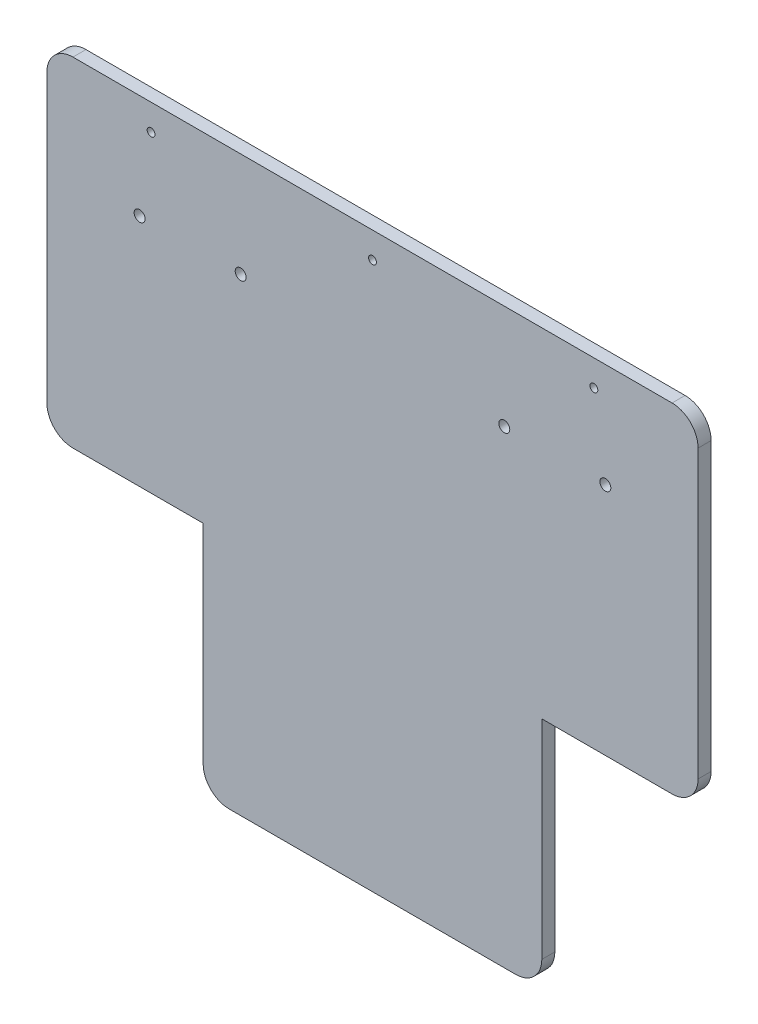
ISO-10303-21;
HEADER;
FILE_DESCRIPTION(('STEP AP214'),'2;1');
FILE_NAME('part.step','',(''),(''),'','','');
FILE_SCHEMA(('AUTOMOTIVE_DESIGN { 1 0 10303 214 1 1 1 1 }'));
ENDSEC;
DATA;
#1=APPLICATION_CONTEXT('core data for automotive mechanical design processes');
#2=APPLICATION_PROTOCOL_DEFINITION('international standard','automotive_design',2000,#1);
#3=PRODUCT_CONTEXT('',#1,'mechanical');
#4=PRODUCT('Part','Part','',(#3));
#5=PRODUCT_RELATED_PRODUCT_CATEGORY('part','',(#4));
#6=PRODUCT_DEFINITION_FORMATION('','',#4);
#7=PRODUCT_DEFINITION_CONTEXT('part definition',#1,'design');
#8=PRODUCT_DEFINITION('design','',#6,#7);
#9=PRODUCT_DEFINITION_SHAPE('','',#8);
#10=(LENGTH_UNIT() NAMED_UNIT(*) SI_UNIT(.MILLI.,.METRE.));
#11=(NAMED_UNIT(*) PLANE_ANGLE_UNIT() SI_UNIT($,.RADIAN.));
#12=(NAMED_UNIT(*) SI_UNIT($,.STERADIAN.) SOLID_ANGLE_UNIT());
#13=UNCERTAINTY_MEASURE_WITH_UNIT(LENGTH_MEASURE(1.E-05),#10,'distance_accuracy_value','');
#14=(GEOMETRIC_REPRESENTATION_CONTEXT(3) GLOBAL_UNCERTAINTY_ASSIGNED_CONTEXT((#13)) GLOBAL_UNIT_ASSIGNED_CONTEXT((#10,
#11,#12)) REPRESENTATION_CONTEXT('',''));
#15=CARTESIAN_POINT('',(0.,0.,0.));
#16=DIRECTION('',(0.,0.,1.));
#17=DIRECTION('',(1.,0.,0.));
#18=AXIS2_PLACEMENT_3D('',#15,#16,#17);
#19=CARTESIAN_POINT('',(10.0000000000001,-220.,5.));
#20=DIRECTION('',(0.,1.,0.));
#21=DIRECTION('',(0.,0.,1.));
#22=AXIS2_PLACEMENT_3D('',#19,#20,#21);
#23=PLANE('',#22);
#24=DIRECTION('',(0.,0.,1.));
#25=VECTOR('',#24,1.);
#26=CARTESIAN_POINT('',(70.0000000000002,-220.,-0.00100000000000013));
#27=LINE('',#26,#25);
#28=CARTESIAN_POINT('',(70.0000000000002,-220.,0.));
#29=VERTEX_POINT('',#28);
#30=CARTESIAN_POINT('',(70.0000000000002,-220.,5.));
#31=VERTEX_POINT('',#30);
#32=EDGE_CURVE('E153',#29,#31,#27,.T.);
#33=ORIENTED_EDGE('',*,*,#32,.F.);
#34=DIRECTION('',(1.,0.,0.));
#35=VECTOR('',#34,1.);
#36=CARTESIAN_POINT('',(10.0000000000001,-220.,0.));
#37=LINE('',#36,#35);
#38=CARTESIAN_POINT('',(180.,-220.,0.));
#39=VERTEX_POINT('',#38);
#40=EDGE_CURVE('E190',#29,#39,#37,.T.);
#41=ORIENTED_EDGE('',*,*,#40,.T.);
#42=DIRECTION('',(0.,0.,1.));
#43=VECTOR('',#42,1.);
#44=CARTESIAN_POINT('',(180.,-220.,-0.00100000000000013));
#45=LINE('',#44,#43);
#46=CARTESIAN_POINT('',(180.,-220.,5.));
#47=VERTEX_POINT('',#46);
#48=EDGE_CURVE('E282',#39,#47,#45,.T.);
#49=ORIENTED_EDGE('',*,*,#48,.T.);
#50=DIRECTION('',(1.,0.,0.));
#51=VECTOR('',#50,1.);
#52=CARTESIAN_POINT('',(10.0000000000001,-220.,5.));
#53=LINE('',#52,#51);
#54=EDGE_CURVE('E159',#31,#47,#53,.T.);
#55=ORIENTED_EDGE('',*,*,#54,.F.);
#56=EDGE_LOOP('',(#33,#41,#49,#55));
#57=FACE_BOUND('',#56,.T.);
#58=ADVANCED_FACE('F37',(#57),#23,.F.);
#59=CARTESIAN_POINT('',(250.,-10.,5.));
#60=DIRECTION('',(-1.,0.,0.));
#61=DIRECTION('',(0.,-1.,0.));
#62=AXIS2_PLACEMENT_3D('',#59,#60,#61);
#63=PLANE('',#62);
#64=DIRECTION('',(0.,0.,1.));
#65=VECTOR('',#64,1.);
#66=CARTESIAN_POINT('',(250.,-120.,-0.00100000000000013));
#67=LINE('',#66,#65);
#68=CARTESIAN_POINT('',(250.,-120.,0.));
#69=VERTEX_POINT('',#68);
#70=CARTESIAN_POINT('',(250.,-120.,5.));
#71=VERTEX_POINT('',#70);
#72=EDGE_CURVE('E270',#69,#71,#67,.T.);
#73=ORIENTED_EDGE('',*,*,#72,.F.);
#74=DIRECTION('',(0.,1.,0.));
#75=VECTOR('',#74,1.);
#76=CARTESIAN_POINT('',(250.,-10.,0.));
#77=LINE('',#76,#75);
#78=CARTESIAN_POINT('',(250.,-10.,0.));
#79=VERTEX_POINT('',#78);
#80=EDGE_CURVE('E186',#69,#79,#77,.T.);
#81=ORIENTED_EDGE('',*,*,#80,.T.);
#82=DIRECTION('',(0.,0.,-1.));
#83=VECTOR('',#82,1.);
#84=CARTESIAN_POINT('',(250.,-10.,5.));
#85=LINE('',#84,#83);
#86=CARTESIAN_POINT('',(250.,-10.,5.));
#87=VERTEX_POINT('',#86);
#88=EDGE_CURVE('E11',#87,#79,#85,.T.);
#89=ORIENTED_EDGE('',*,*,#88,.F.);
#90=DIRECTION('',(0.,1.,0.));
#91=VECTOR('',#90,1.);
#92=CARTESIAN_POINT('',(250.,-10.,5.));
#93=LINE('',#92,#91);
#94=EDGE_CURVE('E163',#71,#87,#93,.T.);
#95=ORIENTED_EDGE('',*,*,#94,.F.);
#96=EDGE_LOOP('',(#73,#81,#89,#95));
#97=FACE_BOUND('',#96,.T.);
#98=ADVANCED_FACE('F327',(#97),#63,.F.);
#99=CARTESIAN_POINT('',(10.,-210.,5.));
#100=DIRECTION('',(0.,0.,1.));
#101=DIRECTION('',(1.,0.,0.));
#102=AXIS2_PLACEMENT_3D('',#99,#100,#101);
#103=PLANE('',#102);
#104=CARTESIAN_POINT('',(35.6,-40.,5.));
#105=DIRECTION('',(0.,0.,1.));
#106=DIRECTION('',(1.,0.,0.));
#107=AXIS2_PLACEMENT_3D('',#104,#105,#106);
#108=CIRCLE('',#107,2.1);
#109=CARTESIAN_POINT('',(37.7,-40.,5.));
#110=VERTEX_POINT('',#109);
#111=EDGE_CURVE('E228',#110,#110,#108,.F.);
#112=ORIENTED_EDGE('',*,*,#111,.T.);
#113=EDGE_LOOP('',(#112));
#114=FACE_BOUND('',#113,.T.);
#115=CARTESIAN_POINT('',(214.4,-40.,5.));
#116=DIRECTION('',(0.,0.,1.));
#117=DIRECTION('',(1.,0.,0.));
#118=AXIS2_PLACEMENT_3D('',#115,#116,#117);
#119=CIRCLE('',#118,2.09999999999996);
#120=CARTESIAN_POINT('',(216.5,-40.,5.));
#121=VERTEX_POINT('',#120);
#122=EDGE_CURVE('E229',#121,#121,#119,.F.);
#123=ORIENTED_EDGE('',*,*,#122,.T.);
#124=EDGE_LOOP('',(#123));
#125=FACE_BOUND('',#124,.T.);
#126=CARTESIAN_POINT('',(175.6,-40.,5.));
#127=DIRECTION('',(0.,0.,1.));
#128=DIRECTION('',(1.,0.,0.));
#129=AXIS2_PLACEMENT_3D('',#126,#127,#128);
#130=CIRCLE('',#129,2.09999999999999);
#131=CARTESIAN_POINT('',(177.7,-40.,5.));
#132=VERTEX_POINT('',#131);
#133=EDGE_CURVE('E239',#132,#132,#130,.F.);
#134=ORIENTED_EDGE('',*,*,#133,.T.);
#135=EDGE_LOOP('',(#134));
#136=FACE_BOUND('',#135,.T.);
#137=CARTESIAN_POINT('',(74.4,-40.,5.));
#138=DIRECTION('',(0.,0.,1.));
#139=DIRECTION('',(1.,0.,0.));
#140=AXIS2_PLACEMENT_3D('',#137,#138,#139);
#141=CIRCLE('',#140,2.1);
#142=CARTESIAN_POINT('',(76.5,-40.,5.));
#143=VERTEX_POINT('',#142);
#144=EDGE_CURVE('E208',#143,#143,#141,.F.);
#145=ORIENTED_EDGE('',*,*,#144,.T.);
#146=EDGE_LOOP('',(#145));
#147=FACE_BOUND('',#146,.T.);
#148=CARTESIAN_POINT('',(40.,-10.,5.));
#149=DIRECTION('',(0.,0.,1.));
#150=DIRECTION('',(1.,0.,0.));
#151=AXIS2_PLACEMENT_3D('',#148,#149,#150);
#152=CIRCLE('',#151,1.5);
#153=CARTESIAN_POINT('',(41.5,-10.,5.));
#154=VERTEX_POINT('',#153);
#155=EDGE_CURVE('E212',#154,#154,#152,.T.);
#156=ORIENTED_EDGE('',*,*,#155,.F.);
#157=EDGE_LOOP('',(#156));
#158=FACE_BOUND('',#157,.T.);
#159=CARTESIAN_POINT('',(125.,-10.,5.));
#160=DIRECTION('',(0.,0.,1.));
#161=DIRECTION('',(1.,0.,0.));
#162=AXIS2_PLACEMENT_3D('',#159,#160,#161);
#163=CIRCLE('',#162,1.5);
#164=CARTESIAN_POINT('',(126.5,-10.,5.));
#165=VERTEX_POINT('',#164);
#166=EDGE_CURVE('E209',#165,#165,#163,.T.);
#167=ORIENTED_EDGE('',*,*,#166,.F.);
#168=EDGE_LOOP('',(#167));
#169=FACE_BOUND('',#168,.T.);
#170=CARTESIAN_POINT('',(210.,-10.,5.));
#171=DIRECTION('',(0.,0.,1.));
#172=DIRECTION('',(1.,0.,0.));
#173=AXIS2_PLACEMENT_3D('',#170,#171,#172);
#174=CIRCLE('',#173,1.5);
#175=CARTESIAN_POINT('',(211.5,-10.,5.));
#176=VERTEX_POINT('',#175);
#177=EDGE_CURVE('E201',#176,#176,#174,.T.);
#178=ORIENTED_EDGE('',*,*,#177,.F.);
#179=EDGE_LOOP('',(#178));
#180=FACE_BOUND('',#179,.T.);
#181=DIRECTION('',(0.,-1.,0.));
#182=VECTOR('',#181,1.);
#183=CARTESIAN_POINT('',(0.,-10.0000000000001,5.));
#184=LINE('',#183,#182);
#185=CARTESIAN_POINT('',(0.,-10.0000000000001,5.));
#186=VERTEX_POINT('',#185);
#187=CARTESIAN_POINT('',(0.,-120.,5.));
#188=VERTEX_POINT('',#187);
#189=EDGE_CURVE('E171',#186,#188,#184,.T.);
#190=ORIENTED_EDGE('',*,*,#189,.T.);
#191=CARTESIAN_POINT('',(10.0000000000001,-120.,5.));
#192=DIRECTION('',(0.,0.,1.));
#193=DIRECTION('',(1.,0.,0.));
#194=AXIS2_PLACEMENT_3D('',#191,#192,#193);
#195=CIRCLE('',#194,10.);
#196=CARTESIAN_POINT('',(10.0000000000001,-130.,5.));
#197=VERTEX_POINT('',#196);
#198=EDGE_CURVE('E138',#188,#197,#195,.T.);
#199=ORIENTED_EDGE('',*,*,#198,.T.);
#200=DIRECTION('',(-1.,0.,0.));
#201=VECTOR('',#200,1.);
#202=CARTESIAN_POINT('',(0.,-130.,5.));
#203=LINE('',#202,#201);
#204=CARTESIAN_POINT('',(60.0000000000001,-130.,5.));
#205=VERTEX_POINT('',#204);
#206=EDGE_CURVE('E248',#205,#197,#203,.T.);
#207=ORIENTED_EDGE('',*,*,#206,.F.);
#208=DIRECTION('',(0.,1.,0.));
#209=VECTOR('',#208,1.);
#210=CARTESIAN_POINT('',(60.0000000000001,-130.,5.));
#211=LINE('',#210,#209);
#212=CARTESIAN_POINT('',(60.0000000000001,-210.,5.));
#213=VERTEX_POINT('',#212);
#214=EDGE_CURVE('E251',#213,#205,#211,.T.);
#215=ORIENTED_EDGE('',*,*,#214,.F.);
#216=CARTESIAN_POINT('',(70.0000000000001,-210.,5.));
#217=DIRECTION('',(0.,0.,1.));
#218=DIRECTION('',(1.,0.,0.));
#219=AXIS2_PLACEMENT_3D('',#216,#217,#218);
#220=CIRCLE('',#219,10.);
#221=EDGE_CURVE('E59',#213,#31,#220,.T.);
#222=ORIENTED_EDGE('',*,*,#221,.T.);
#223=ORIENTED_EDGE('',*,*,#54,.T.);
#224=CARTESIAN_POINT('',(180.,-210.,5.));
#225=DIRECTION('',(0.,0.,1.));
#226=DIRECTION('',(1.,0.,0.));
#227=AXIS2_PLACEMENT_3D('',#224,#225,#226);
#228=CIRCLE('',#227,10.);
#229=CARTESIAN_POINT('',(190.,-210.,5.));
#230=VERTEX_POINT('',#229);
#231=EDGE_CURVE('E273',#230,#47,#228,.F.);
#232=ORIENTED_EDGE('',*,*,#231,.F.);
#233=DIRECTION('',(0.,-1.,0.));
#234=VECTOR('',#233,1.);
#235=CARTESIAN_POINT('',(190.,-130.,5.));
#236=LINE('',#235,#234);
#237=CARTESIAN_POINT('',(190.,-130.,5.));
#238=VERTEX_POINT('',#237);
#239=EDGE_CURVE('E261',#238,#230,#236,.T.);
#240=ORIENTED_EDGE('',*,*,#239,.F.);
#241=DIRECTION('',(-1.,0.,0.));
#242=VECTOR('',#241,1.);
#243=CARTESIAN_POINT('',(250.,-130.,5.));
#244=LINE('',#243,#242);
#245=CARTESIAN_POINT('',(240.,-130.,5.));
#246=VERTEX_POINT('',#245);
#247=EDGE_CURVE('E264',#246,#238,#244,.T.);
#248=ORIENTED_EDGE('',*,*,#247,.F.);
#249=CARTESIAN_POINT('',(240.,-120.,5.));
#250=DIRECTION('',(0.,0.,1.));
#251=DIRECTION('',(1.,0.,0.));
#252=AXIS2_PLACEMENT_3D('',#249,#250,#251);
#253=CIRCLE('',#252,10.);
#254=EDGE_CURVE('E271',#246,#71,#253,.T.);
#255=ORIENTED_EDGE('',*,*,#254,.T.);
#256=ORIENTED_EDGE('',*,*,#94,.T.);
#257=CARTESIAN_POINT('',(240.,-10.,5.));
#258=DIRECTION('',(0.,0.,1.));
#259=DIRECTION('',(-1.,0.,0.));
#260=AXIS2_PLACEMENT_3D('',#257,#258,#259);
#261=CIRCLE('',#260,10.);
#262=CARTESIAN_POINT('',(240.,0.,5.));
#263=VERTEX_POINT('',#262);
#264=EDGE_CURVE('E198',#87,#263,#261,.T.);
#265=ORIENTED_EDGE('',*,*,#264,.T.);
#266=DIRECTION('',(-1.,0.,0.));
#267=VECTOR('',#266,1.);
#268=CARTESIAN_POINT('',(10.0000000000001,0.,5.));
#269=LINE('',#268,#267);
#270=CARTESIAN_POINT('',(10.0000000000001,0.,5.));
#271=VERTEX_POINT('',#270);
#272=EDGE_CURVE('E180',#263,#271,#269,.T.);
#273=ORIENTED_EDGE('',*,*,#272,.T.);
#274=CARTESIAN_POINT('',(10.,-10.,5.));
#275=DIRECTION('',(0.,0.,1.));
#276=DIRECTION('',(1.,0.,0.));
#277=AXIS2_PLACEMENT_3D('',#274,#275,#276);
#278=CIRCLE('',#277,10.);
#279=EDGE_CURVE('E195',#271,#186,#278,.T.);
#280=ORIENTED_EDGE('',*,*,#279,.T.);
#281=EDGE_LOOP('',(#190,#199,#207,#215,#222,#223,#232,#240,#248,#255,#256,#265,#273,#280));
#282=FACE_BOUND('',#281,.T.);
#283=ADVANCED_FACE('F297',(#114,#125,#136,#147,#158,#169,#180,#282),#103,.T.);
#284=CARTESIAN_POINT('',(10.,-210.,0.));
#285=DIRECTION('',(0.,0.,1.));
#286=DIRECTION('',(1.,0.,0.));
#287=AXIS2_PLACEMENT_3D('',#284,#285,#286);
#288=PLANE('',#287);
#289=CARTESIAN_POINT('',(210.,-10.,0.));
#290=DIRECTION('',(0.,0.,1.));
#291=DIRECTION('',(1.,0.,0.));
#292=AXIS2_PLACEMENT_3D('',#289,#290,#291);
#293=CIRCLE('',#292,1.5);
#294=CARTESIAN_POINT('',(211.5,-10.,0.));
#295=VERTEX_POINT('',#294);
#296=EDGE_CURVE('E205',#295,#295,#293,.F.);
#297=ORIENTED_EDGE('',*,*,#296,.F.);
#298=EDGE_LOOP('',(#297));
#299=FACE_BOUND('',#298,.T.);
#300=CARTESIAN_POINT('',(125.,-10.,0.));
#301=DIRECTION('',(0.,0.,1.));
#302=DIRECTION('',(1.,0.,0.));
#303=AXIS2_PLACEMENT_3D('',#300,#301,#302);
#304=CIRCLE('',#303,1.5);
#305=CARTESIAN_POINT('',(126.5,-10.,0.));
#306=VERTEX_POINT('',#305);
#307=EDGE_CURVE('E204',#306,#306,#304,.F.);
#308=ORIENTED_EDGE('',*,*,#307,.F.);
#309=EDGE_LOOP('',(#308));
#310=FACE_BOUND('',#309,.T.);
#311=CARTESIAN_POINT('',(40.,-10.,0.));
#312=DIRECTION('',(0.,0.,1.));
#313=DIRECTION('',(1.,0.,0.));
#314=AXIS2_PLACEMENT_3D('',#311,#312,#313);
#315=CIRCLE('',#314,1.5);
#316=CARTESIAN_POINT('',(41.5,-10.,0.));
#317=VERTEX_POINT('',#316);
#318=EDGE_CURVE('E193',#317,#317,#315,.F.);
#319=ORIENTED_EDGE('',*,*,#318,.F.);
#320=EDGE_LOOP('',(#319));
#321=FACE_BOUND('',#320,.T.);
#322=CARTESIAN_POINT('',(74.4,-40.,0.));
#323=DIRECTION('',(0.,0.,-1.));
#324=DIRECTION('',(-1.,0.,0.));
#325=AXIS2_PLACEMENT_3D('',#322,#323,#324);
#326=CIRCLE('',#325,2.1);
#327=CARTESIAN_POINT('',(72.3,-40.,0.));
#328=VERTEX_POINT('',#327);
#329=EDGE_CURVE('E221',#328,#328,#326,.T.);
#330=ORIENTED_EDGE('',*,*,#329,.F.);
#331=EDGE_LOOP('',(#330));
#332=FACE_BOUND('',#331,.T.);
#333=CARTESIAN_POINT('',(175.6,-40.,0.));
#334=DIRECTION('',(0.,0.,-1.));
#335=DIRECTION('',(1.,0.,0.));
#336=AXIS2_PLACEMENT_3D('',#333,#334,#335);
#337=CIRCLE('',#336,2.09999999999999);
#338=CARTESIAN_POINT('',(177.7,-40.,0.));
#339=VERTEX_POINT('',#338);
#340=EDGE_CURVE('E232',#339,#339,#337,.T.);
#341=ORIENTED_EDGE('',*,*,#340,.F.);
#342=EDGE_LOOP('',(#341));
#343=FACE_BOUND('',#342,.T.);
#344=CARTESIAN_POINT('',(214.4,-40.,0.));
#345=DIRECTION('',(0.,0.,-1.));
#346=DIRECTION('',(1.,0.,0.));
#347=AXIS2_PLACEMENT_3D('',#344,#345,#346);
#348=CIRCLE('',#347,2.09999999999996);
#349=CARTESIAN_POINT('',(216.5,-40.,0.));
#350=VERTEX_POINT('',#349);
#351=EDGE_CURVE('E225',#350,#350,#348,.T.);
#352=ORIENTED_EDGE('',*,*,#351,.F.);
#353=EDGE_LOOP('',(#352));
#354=FACE_BOUND('',#353,.T.);
#355=CARTESIAN_POINT('',(35.6,-40.,0.));
#356=DIRECTION('',(0.,0.,-1.));
#357=DIRECTION('',(-1.,0.,0.));
#358=AXIS2_PLACEMENT_3D('',#355,#356,#357);
#359=CIRCLE('',#358,2.1);
#360=CARTESIAN_POINT('',(33.5,-40.,0.));
#361=VERTEX_POINT('',#360);
#362=EDGE_CURVE('E224',#361,#361,#359,.T.);
#363=ORIENTED_EDGE('',*,*,#362,.F.);
#364=EDGE_LOOP('',(#363));
#365=FACE_BOUND('',#364,.T.);
#366=CARTESIAN_POINT('',(10.0000000000001,-120.,0.));
#367=DIRECTION('',(0.,0.,1.));
#368=DIRECTION('',(1.,0.,0.));
#369=AXIS2_PLACEMENT_3D('',#366,#367,#368);
#370=CIRCLE('',#369,10.);
#371=CARTESIAN_POINT('',(10.0000000000001,-130.,0.));
#372=VERTEX_POINT('',#371);
#373=CARTESIAN_POINT('',(0.,-120.,0.));
#374=VERTEX_POINT('',#373);
#375=EDGE_CURVE('E51',#372,#374,#370,.F.);
#376=ORIENTED_EDGE('',*,*,#375,.T.);
#377=DIRECTION('',(0.,-1.,0.));
#378=VECTOR('',#377,1.);
#379=CARTESIAN_POINT('',(0.,-10.0000000000001,0.));
#380=LINE('',#379,#378);
#381=CARTESIAN_POINT('',(0.,-10.0000000000001,0.));
#382=VERTEX_POINT('',#381);
#383=EDGE_CURVE('E150',#382,#374,#380,.T.);
#384=ORIENTED_EDGE('',*,*,#383,.F.);
#385=CARTESIAN_POINT('',(10.,-10.,0.));
#386=DIRECTION('',(0.,0.,1.));
#387=DIRECTION('',(1.,0.,0.));
#388=AXIS2_PLACEMENT_3D('',#385,#386,#387);
#389=CIRCLE('',#388,10.);
#390=CARTESIAN_POINT('',(10.0000000000001,0.,0.));
#391=VERTEX_POINT('',#390);
#392=EDGE_CURVE('E160',#391,#382,#389,.T.);
#393=ORIENTED_EDGE('',*,*,#392,.F.);
#394=DIRECTION('',(-1.,0.,0.));
#395=VECTOR('',#394,1.);
#396=CARTESIAN_POINT('',(10.0000000000001,0.,0.));
#397=LINE('',#396,#395);
#398=CARTESIAN_POINT('',(240.,0.,0.));
#399=VERTEX_POINT('',#398);
#400=EDGE_CURVE('E165',#399,#391,#397,.T.);
#401=ORIENTED_EDGE('',*,*,#400,.F.);
#402=CARTESIAN_POINT('',(240.,-10.,0.));
#403=DIRECTION('',(0.,0.,1.));
#404=DIRECTION('',(-1.,0.,0.));
#405=AXIS2_PLACEMENT_3D('',#402,#403,#404);
#406=CIRCLE('',#405,10.);
#407=EDGE_CURVE('E185',#79,#399,#406,.T.);
#408=ORIENTED_EDGE('',*,*,#407,.F.);
#409=ORIENTED_EDGE('',*,*,#80,.F.);
#410=CARTESIAN_POINT('',(240.,-120.,0.));
#411=DIRECTION('',(0.,0.,1.));
#412=DIRECTION('',(1.,0.,0.));
#413=AXIS2_PLACEMENT_3D('',#410,#411,#412);
#414=CIRCLE('',#413,10.);
#415=CARTESIAN_POINT('',(240.,-130.,0.));
#416=VERTEX_POINT('',#415);
#417=EDGE_CURVE('E276',#69,#416,#414,.F.);
#418=ORIENTED_EDGE('',*,*,#417,.T.);
#419=DIRECTION('',(1.,0.,0.));
#420=VECTOR('',#419,1.);
#421=CARTESIAN_POINT('',(250.,-130.,0.));
#422=LINE('',#421,#420);
#423=CARTESIAN_POINT('',(190.,-130.,0.));
#424=VERTEX_POINT('',#423);
#425=EDGE_CURVE('E242',#424,#416,#422,.T.);
#426=ORIENTED_EDGE('',*,*,#425,.F.);
#427=DIRECTION('',(0.,1.,0.));
#428=VECTOR('',#427,1.);
#429=CARTESIAN_POINT('',(190.,-130.,0.));
#430=LINE('',#429,#428);
#431=CARTESIAN_POINT('',(190.,-210.,0.));
#432=VERTEX_POINT('',#431);
#433=EDGE_CURVE('E246',#432,#424,#430,.T.);
#434=ORIENTED_EDGE('',*,*,#433,.F.);
#435=CARTESIAN_POINT('',(180.,-210.,0.));
#436=DIRECTION('',(0.,0.,1.));
#437=DIRECTION('',(1.,0.,0.));
#438=AXIS2_PLACEMENT_3D('',#435,#436,#437);
#439=CIRCLE('',#438,10.);
#440=EDGE_CURVE('E279',#39,#432,#439,.T.);
#441=ORIENTED_EDGE('',*,*,#440,.F.);
#442=ORIENTED_EDGE('',*,*,#40,.F.);
#443=CARTESIAN_POINT('',(70.0000000000001,-210.,0.));
#444=DIRECTION('',(0.,0.,1.));
#445=DIRECTION('',(1.,0.,0.));
#446=AXIS2_PLACEMENT_3D('',#443,#444,#445);
#447=CIRCLE('',#446,10.);
#448=CARTESIAN_POINT('',(60.0000000000001,-210.,0.));
#449=VERTEX_POINT('',#448);
#450=EDGE_CURVE('E281',#29,#449,#447,.F.);
#451=ORIENTED_EDGE('',*,*,#450,.T.);
#452=DIRECTION('',(0.,-1.,0.));
#453=VECTOR('',#452,1.);
#454=CARTESIAN_POINT('',(60.0000000000001,-130.,0.));
#455=LINE('',#454,#453);
#456=CARTESIAN_POINT('',(60.0000000000001,-130.,0.));
#457=VERTEX_POINT('',#456);
#458=EDGE_CURVE('E243',#457,#449,#455,.T.);
#459=ORIENTED_EDGE('',*,*,#458,.F.);
#460=DIRECTION('',(1.,0.,0.));
#461=VECTOR('',#460,1.);
#462=CARTESIAN_POINT('',(0.,-130.,0.));
#463=LINE('',#462,#461);
#464=EDGE_CURVE('E152',#372,#457,#463,.T.);
#465=ORIENTED_EDGE('',*,*,#464,.F.);
#466=EDGE_LOOP('',(#376,#384,#393,#401,#408,#409,#418,#426,#434,#441,#442,#451,#459,#465));
#467=FACE_BOUND('',#466,.T.);
#468=ADVANCED_FACE('F148',(#299,#310,#321,#332,#343,#354,#365,#467),#288,.F.);
#469=CARTESIAN_POINT('',(0.,-130.,-0.00100000000000013));
#470=DIRECTION('',(0.,1.,0.));
#471=DIRECTION('',(0.,0.,1.));
#472=AXIS2_PLACEMENT_3D('',#469,#470,#471);
#473=PLANE('',#472);
#474=DIRECTION('',(0.,0.,1.));
#475=VECTOR('',#474,1.);
#476=CARTESIAN_POINT('',(10.0000000000001,-130.,-0.00100000000000013));
#477=LINE('',#476,#475);
#478=EDGE_CURVE('E143',#372,#197,#477,.T.);
#479=ORIENTED_EDGE('',*,*,#478,.F.);
#480=ORIENTED_EDGE('',*,*,#464,.T.);
#481=DIRECTION('',(0.,0.,1.));
#482=VECTOR('',#481,1.);
#483=CARTESIAN_POINT('',(60.0000000000001,-130.,-0.00100000000000013));
#484=LINE('',#483,#482);
#485=EDGE_CURVE('E253',#457,#205,#484,.T.);
#486=ORIENTED_EDGE('',*,*,#485,.T.);
#487=ORIENTED_EDGE('',*,*,#206,.T.);
#488=EDGE_LOOP('',(#479,#480,#486,#487));
#489=FACE_BOUND('',#488,.T.);
#490=ADVANCED_FACE('F300',(#489),#473,.F.);
#491=CARTESIAN_POINT('',(240.,-10.,5.));
#492=DIRECTION('',(0.,0.,-1.));
#493=DIRECTION('',(-1.,0.,0.));
#494=AXIS2_PLACEMENT_3D('',#491,#492,#493);
#495=CYLINDRICAL_SURFACE('',#494,10.);
#496=ORIENTED_EDGE('',*,*,#407,.T.);
#497=DIRECTION('',(0.,0.,-1.));
#498=VECTOR('',#497,1.);
#499=CARTESIAN_POINT('',(240.,0.,5.));
#500=LINE('',#499,#498);
#501=EDGE_CURVE('E44',#263,#399,#500,.T.);
#502=ORIENTED_EDGE('',*,*,#501,.F.);
#503=ORIENTED_EDGE('',*,*,#264,.F.);
#504=ORIENTED_EDGE('',*,*,#88,.T.);
#505=EDGE_LOOP('',(#496,#502,#503,#504));
#506=FACE_BOUND('',#505,.T.);
#507=ADVANCED_FACE('F329',(#506),#495,.T.);
#508=CARTESIAN_POINT('',(10.0000000000001,0.,5.));
#509=DIRECTION('',(0.,-1.,0.));
#510=DIRECTION('',(0.,0.,-1.));
#511=AXIS2_PLACEMENT_3D('',#508,#509,#510);
#512=PLANE('',#511);
#513=ORIENTED_EDGE('',*,*,#400,.T.);
#514=DIRECTION('',(0.,0.,-1.));
#515=VECTOR('',#514,1.);
#516=CARTESIAN_POINT('',(10.0000000000001,0.,5.));
#517=LINE('',#516,#515);
#518=EDGE_CURVE('E170',#271,#391,#517,.T.);
#519=ORIENTED_EDGE('',*,*,#518,.F.);
#520=ORIENTED_EDGE('',*,*,#272,.F.);
#521=ORIENTED_EDGE('',*,*,#501,.T.);
#522=EDGE_LOOP('',(#513,#519,#520,#521));
#523=FACE_BOUND('',#522,.T.);
#524=ADVANCED_FACE('F178',(#523),#512,.F.);
#525=CARTESIAN_POINT('',(10.,-10.,5.));
#526=DIRECTION('',(0.,0.,-1.));
#527=DIRECTION('',(-1.,0.,0.));
#528=AXIS2_PLACEMENT_3D('',#525,#526,#527);
#529=CYLINDRICAL_SURFACE('',#528,10.);
#530=ORIENTED_EDGE('',*,*,#392,.T.);
#531=DIRECTION('',(0.,0.,-1.));
#532=VECTOR('',#531,1.);
#533=CARTESIAN_POINT('',(0.,-10.0000000000001,5.));
#534=LINE('',#533,#532);
#535=EDGE_CURVE('E158',#186,#382,#534,.T.);
#536=ORIENTED_EDGE('',*,*,#535,.F.);
#537=ORIENTED_EDGE('',*,*,#279,.F.);
#538=ORIENTED_EDGE('',*,*,#518,.T.);
#539=EDGE_LOOP('',(#530,#536,#537,#538));
#540=FACE_BOUND('',#539,.T.);
#541=ADVANCED_FACE('F336',(#540),#529,.T.);
#542=CARTESIAN_POINT('',(0.,-10.0000000000001,5.));
#543=DIRECTION('',(1.,0.,0.));
#544=DIRECTION('',(0.,1.,0.));
#545=AXIS2_PLACEMENT_3D('',#542,#543,#544);
#546=PLANE('',#545);
#547=ORIENTED_EDGE('',*,*,#383,.T.);
#548=DIRECTION('',(0.,0.,1.));
#549=VECTOR('',#548,1.);
#550=CARTESIAN_POINT('',(0.,-120.,-0.00100000000000013));
#551=LINE('',#550,#549);
#552=EDGE_CURVE('E135',#374,#188,#551,.T.);
#553=ORIENTED_EDGE('',*,*,#552,.T.);
#554=ORIENTED_EDGE('',*,*,#189,.F.);
#555=ORIENTED_EDGE('',*,*,#535,.T.);
#556=EDGE_LOOP('',(#547,#553,#554,#555));
#557=FACE_BOUND('',#556,.T.);
#558=ADVANCED_FACE('F156',(#557),#546,.F.);
#559=CARTESIAN_POINT('',(210.,-10.,-4.24264068711928));
#560=DIRECTION('',(0.,0.,1.));
#561=DIRECTION('',(1.,0.,0.));
#562=AXIS2_PLACEMENT_3D('',#559,#560,#561);
#563=CYLINDRICAL_SURFACE('',#562,1.5);
#564=ORIENTED_EDGE('',*,*,#296,.T.);
#565=EDGE_LOOP('',(#564));
#566=FACE_BOUND('',#565,.T.);
#567=ORIENTED_EDGE('',*,*,#177,.T.);
#568=EDGE_LOOP('',(#567));
#569=FACE_BOUND('',#568,.T.);
#570=ADVANCED_FACE('F355',(#566,#569),#563,.F.);
#571=CARTESIAN_POINT('',(125.,-10.,-4.24264068711928));
#572=DIRECTION('',(0.,0.,1.));
#573=DIRECTION('',(1.,0.,0.));
#574=AXIS2_PLACEMENT_3D('',#571,#572,#573);
#575=CYLINDRICAL_SURFACE('',#574,1.5);
#576=ORIENTED_EDGE('',*,*,#307,.T.);
#577=EDGE_LOOP('',(#576));
#578=FACE_BOUND('',#577,.T.);
#579=ORIENTED_EDGE('',*,*,#166,.T.);
#580=EDGE_LOOP('',(#579));
#581=FACE_BOUND('',#580,.T.);
#582=ADVANCED_FACE('F379',(#578,#581),#575,.F.);
#583=CARTESIAN_POINT('',(40.,-10.,-4.24264068711928));
#584=DIRECTION('',(0.,0.,1.));
#585=DIRECTION('',(1.,0.,0.));
#586=AXIS2_PLACEMENT_3D('',#583,#584,#585);
#587=CYLINDRICAL_SURFACE('',#586,1.5);
#588=ORIENTED_EDGE('',*,*,#318,.T.);
#589=EDGE_LOOP('',(#588));
#590=FACE_BOUND('',#589,.T.);
#591=ORIENTED_EDGE('',*,*,#155,.T.);
#592=EDGE_LOOP('',(#591));
#593=FACE_BOUND('',#592,.T.);
#594=ADVANCED_FACE('F386',(#590,#593),#587,.F.);
#595=CARTESIAN_POINT('',(74.4,-40.,10.939696961967));
#596=DIRECTION('',(0.,0.,-1.));
#597=DIRECTION('',(-1.,0.,0.));
#598=AXIS2_PLACEMENT_3D('',#595,#596,#597);
#599=CYLINDRICAL_SURFACE('',#598,2.1);
#600=ORIENTED_EDGE('',*,*,#329,.T.);
#601=EDGE_LOOP('',(#600));
#602=FACE_BOUND('',#601,.T.);
#603=ORIENTED_EDGE('',*,*,#144,.F.);
#604=EDGE_LOOP('',(#603));
#605=FACE_BOUND('',#604,.T.);
#606=ADVANCED_FACE('F393',(#602,#605),#599,.F.);
#607=CARTESIAN_POINT('',(175.6,-40.,10.939696961967));
#608=DIRECTION('',(0.,0.,-1.));
#609=DIRECTION('',(-1.,0.,0.));
#610=AXIS2_PLACEMENT_3D('',#607,#608,#609);
#611=CYLINDRICAL_SURFACE('',#610,2.09999999999999);
#612=ORIENTED_EDGE('',*,*,#340,.T.);
#613=EDGE_LOOP('',(#612));
#614=FACE_BOUND('',#613,.T.);
#615=ORIENTED_EDGE('',*,*,#133,.F.);
#616=EDGE_LOOP('',(#615));
#617=FACE_BOUND('',#616,.T.);
#618=ADVANCED_FACE('F401',(#614,#617),#611,.F.);
#619=CARTESIAN_POINT('',(214.4,-40.,10.939696961967));
#620=DIRECTION('',(0.,0.,-1.));
#621=DIRECTION('',(-1.,0.,0.));
#622=AXIS2_PLACEMENT_3D('',#619,#620,#621);
#623=CYLINDRICAL_SURFACE('',#622,2.09999999999996);
#624=ORIENTED_EDGE('',*,*,#351,.T.);
#625=EDGE_LOOP('',(#624));
#626=FACE_BOUND('',#625,.T.);
#627=ORIENTED_EDGE('',*,*,#122,.F.);
#628=EDGE_LOOP('',(#627));
#629=FACE_BOUND('',#628,.T.);
#630=ADVANCED_FACE('F409',(#626,#629),#623,.F.);
#631=CARTESIAN_POINT('',(35.6,-40.,10.939696961967));
#632=DIRECTION('',(0.,0.,-1.));
#633=DIRECTION('',(-1.,0.,0.));
#634=AXIS2_PLACEMENT_3D('',#631,#632,#633);
#635=CYLINDRICAL_SURFACE('',#634,2.1);
#636=ORIENTED_EDGE('',*,*,#362,.T.);
#637=EDGE_LOOP('',(#636));
#638=FACE_BOUND('',#637,.T.);
#639=ORIENTED_EDGE('',*,*,#111,.F.);
#640=EDGE_LOOP('',(#639));
#641=FACE_BOUND('',#640,.T.);
#642=ADVANCED_FACE('F417',(#638,#641),#635,.F.);
#643=CARTESIAN_POINT('',(60.0000000000001,-130.,-0.00100000000000013));
#644=DIRECTION('',(1.,0.,0.));
#645=DIRECTION('',(0.,1.,0.));
#646=AXIS2_PLACEMENT_3D('',#643,#644,#645);
#647=PLANE('',#646);
#648=ORIENTED_EDGE('',*,*,#458,.T.);
#649=DIRECTION('',(0.,0.,1.));
#650=VECTOR('',#649,1.);
#651=CARTESIAN_POINT('',(60.0000000000001,-210.,-0.00100000000000013));
#652=LINE('',#651,#650);
#653=EDGE_CURVE('E288',#449,#213,#652,.T.);
#654=ORIENTED_EDGE('',*,*,#653,.T.);
#655=ORIENTED_EDGE('',*,*,#214,.T.);
#656=ORIENTED_EDGE('',*,*,#485,.F.);
#657=EDGE_LOOP('',(#648,#654,#655,#656));
#658=FACE_BOUND('',#657,.T.);
#659=ADVANCED_FACE('F303',(#658),#647,.F.);
#660=CARTESIAN_POINT('',(190.,-130.,-0.00100000000000013));
#661=DIRECTION('',(-1.,0.,0.));
#662=DIRECTION('',(0.,-1.,0.));
#663=AXIS2_PLACEMENT_3D('',#660,#661,#662);
#664=PLANE('',#663);
#665=ORIENTED_EDGE('',*,*,#239,.T.);
#666=DIRECTION('',(0.,0.,1.));
#667=VECTOR('',#666,1.);
#668=CARTESIAN_POINT('',(190.,-210.,-0.00100000000000013));
#669=LINE('',#668,#667);
#670=EDGE_CURVE('E283',#432,#230,#669,.T.);
#671=ORIENTED_EDGE('',*,*,#670,.F.);
#672=ORIENTED_EDGE('',*,*,#433,.T.);
#673=DIRECTION('',(0.,0.,1.));
#674=VECTOR('',#673,1.);
#675=CARTESIAN_POINT('',(190.,-130.,-0.00100000000000013));
#676=LINE('',#675,#674);
#677=EDGE_CURVE('E258',#424,#238,#676,.T.);
#678=ORIENTED_EDGE('',*,*,#677,.T.);
#679=EDGE_LOOP('',(#665,#671,#672,#678));
#680=FACE_BOUND('',#679,.T.);
#681=ADVANCED_FACE('F316',(#680),#664,.F.);
#682=CARTESIAN_POINT('',(250.,-130.,-0.00100000000000013));
#683=DIRECTION('',(0.,1.,0.));
#684=DIRECTION('',(0.,0.,1.));
#685=AXIS2_PLACEMENT_3D('',#682,#683,#684);
#686=PLANE('',#685);
#687=ORIENTED_EDGE('',*,*,#425,.T.);
#688=DIRECTION('',(0.,0.,1.));
#689=VECTOR('',#688,1.);
#690=CARTESIAN_POINT('',(240.,-130.,-0.00100000000000013));
#691=LINE('',#690,#689);
#692=EDGE_CURVE('E267',#416,#246,#691,.T.);
#693=ORIENTED_EDGE('',*,*,#692,.T.);
#694=ORIENTED_EDGE('',*,*,#247,.T.);
#695=ORIENTED_EDGE('',*,*,#677,.F.);
#696=EDGE_LOOP('',(#687,#693,#694,#695));
#697=FACE_BOUND('',#696,.T.);
#698=ADVANCED_FACE('F321',(#697),#686,.F.);
#699=CARTESIAN_POINT('',(240.,-120.,-0.00100000000000013));
#700=DIRECTION('',(0.,0.,1.));
#701=DIRECTION('',(1.,0.,0.));
#702=AXIS2_PLACEMENT_3D('',#699,#700,#701);
#703=CYLINDRICAL_SURFACE('',#702,10.);
#704=ORIENTED_EDGE('',*,*,#72,.T.);
#705=ORIENTED_EDGE('',*,*,#254,.F.);
#706=ORIENTED_EDGE('',*,*,#692,.F.);
#707=ORIENTED_EDGE('',*,*,#417,.F.);
#708=EDGE_LOOP('',(#704,#705,#706,#707));
#709=FACE_BOUND('',#708,.T.);
#710=ADVANCED_FACE('F324',(#709),#703,.T.);
#711=CARTESIAN_POINT('',(180.,-210.,-0.00100000000000013));
#712=DIRECTION('',(0.,0.,1.));
#713=DIRECTION('',(1.,0.,0.));
#714=AXIS2_PLACEMENT_3D('',#711,#712,#713);
#715=CYLINDRICAL_SURFACE('',#714,10.);
#716=ORIENTED_EDGE('',*,*,#440,.T.);
#717=ORIENTED_EDGE('',*,*,#670,.T.);
#718=ORIENTED_EDGE('',*,*,#231,.T.);
#719=ORIENTED_EDGE('',*,*,#48,.F.);
#720=EDGE_LOOP('',(#716,#717,#718,#719));
#721=FACE_BOUND('',#720,.T.);
#722=ADVANCED_FACE('F449',(#721),#715,.T.);
#723=CARTESIAN_POINT('',(70.0000000000001,-210.,-0.00100000000000013));
#724=DIRECTION('',(0.,0.,1.));
#725=DIRECTION('',(1.,0.,0.));
#726=AXIS2_PLACEMENT_3D('',#723,#724,#725);
#727=CYLINDRICAL_SURFACE('',#726,10.);
#728=ORIENTED_EDGE('',*,*,#32,.T.);
#729=ORIENTED_EDGE('',*,*,#221,.F.);
#730=ORIENTED_EDGE('',*,*,#653,.F.);
#731=ORIENTED_EDGE('',*,*,#450,.F.);
#732=EDGE_LOOP('',(#728,#729,#730,#731));
#733=FACE_BOUND('',#732,.T.);
#734=ADVANCED_FACE('F307',(#733),#727,.T.);
#735=CARTESIAN_POINT('',(10.0000000000001,-120.,-0.00100000000000013));
#736=DIRECTION('',(0.,0.,1.));
#737=DIRECTION('',(1.,0.,0.));
#738=AXIS2_PLACEMENT_3D('',#735,#736,#737);
#739=CYLINDRICAL_SURFACE('',#738,10.);
#740=ORIENTED_EDGE('',*,*,#478,.T.);
#741=ORIENTED_EDGE('',*,*,#198,.F.);
#742=ORIENTED_EDGE('',*,*,#552,.F.);
#743=ORIENTED_EDGE('',*,*,#375,.F.);
#744=EDGE_LOOP('',(#740,#741,#742,#743));
#745=FACE_BOUND('',#744,.T.);
#746=ADVANCED_FACE('F136',(#745),#739,.T.);
#747=CLOSED_SHELL('',(#58,#98,#283,#468,#490,#507,#524,#541,#558,#570,#582,#594,#606,#618,#630,
#642,#659,#681,#698,#710,#722,#734,#746));
#748=MANIFOLD_SOLID_BREP('B2',#747);
#749=ADVANCED_BREP_SHAPE_REPRESENTATION('',(#18,#748),#14);
#750=SHAPE_DEFINITION_REPRESENTATION(#9,#749);
ENDSEC;
END-ISO-10303-21;
